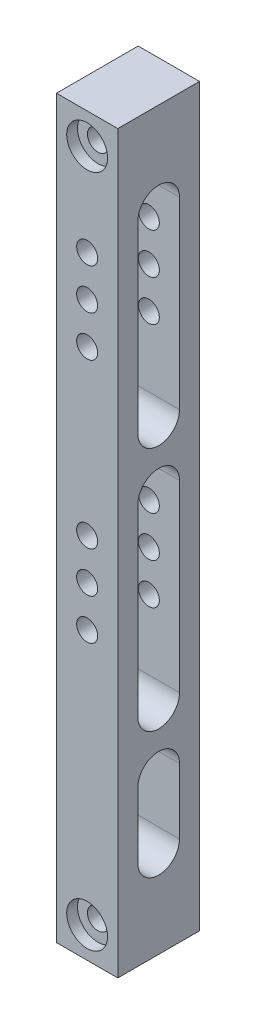
ISO-10303-21;
HEADER;
FILE_DESCRIPTION(('STEP AP214'),'2;1');
FILE_NAME('part.step','',(''),(''),'','','');
FILE_SCHEMA(('AUTOMOTIVE_DESIGN { 1 0 10303 214 1 1 1 1 }'));
ENDSEC;
DATA;
#1=APPLICATION_CONTEXT('core data for automotive mechanical design processes');
#2=APPLICATION_PROTOCOL_DEFINITION('international standard','automotive_design',2000,#1);
#3=PRODUCT_CONTEXT('',#1,'mechanical');
#4=PRODUCT('Part','Part','',(#3));
#5=PRODUCT_RELATED_PRODUCT_CATEGORY('part','',(#4));
#6=PRODUCT_DEFINITION_FORMATION('','',#4);
#7=PRODUCT_DEFINITION_CONTEXT('part definition',#1,'design');
#8=PRODUCT_DEFINITION('design','',#6,#7);
#9=PRODUCT_DEFINITION_SHAPE('','',#8);
#10=(LENGTH_UNIT() NAMED_UNIT(*) SI_UNIT(.MILLI.,.METRE.));
#11=(NAMED_UNIT(*) PLANE_ANGLE_UNIT() SI_UNIT($,.RADIAN.));
#12=(NAMED_UNIT(*) SI_UNIT($,.STERADIAN.) SOLID_ANGLE_UNIT());
#13=UNCERTAINTY_MEASURE_WITH_UNIT(LENGTH_MEASURE(1.E-05),#10,'distance_accuracy_value','');
#14=(GEOMETRIC_REPRESENTATION_CONTEXT(3) GLOBAL_UNCERTAINTY_ASSIGNED_CONTEXT((#13)) GLOBAL_UNIT_ASSIGNED_CONTEXT((#10,
#11,#12)) REPRESENTATION_CONTEXT('',''));
#15=CARTESIAN_POINT('',(0.,0.,0.));
#16=DIRECTION('',(0.,0.,1.));
#17=DIRECTION('',(1.,0.,0.));
#18=AXIS2_PLACEMENT_3D('',#15,#16,#17);
#19=CARTESIAN_POINT('',(-9.525,190.5,12.7));
#20=DIRECTION('',(0.,0.,-1.));
#21=DIRECTION('',(-1.,0.,0.));
#22=AXIS2_PLACEMENT_3D('',#19,#20,#21);
#23=CYLINDRICAL_SURFACE('',#22,3.2639);
#24=CARTESIAN_POINT('',(-9.525,190.5,6.477));
#25=DIRECTION('',(0.,0.,1.));
#26=DIRECTION('',(1.,0.,0.));
#27=AXIS2_PLACEMENT_3D('',#24,#25,#26);
#28=CIRCLE('',#27,3.2639);
#29=CARTESIAN_POINT('',(-6.2611,190.5,6.477));
#30=VERTEX_POINT('',#29);
#31=EDGE_CURVE('E291',#30,#30,#28,.T.);
#32=ORIENTED_EDGE('',*,*,#31,.F.);
#33=EDGE_LOOP('',(#32));
#34=FACE_BOUND('',#33,.T.);
#35=CARTESIAN_POINT('',(-9.525,190.5,12.7));
#36=DIRECTION('',(0.,0.,1.));
#37=DIRECTION('',(1.,0.,0.));
#38=AXIS2_PLACEMENT_3D('',#35,#36,#37);
#39=CIRCLE('',#38,3.2639);
#40=CARTESIAN_POINT('',(-6.2611,190.5,12.7));
#41=VERTEX_POINT('',#40);
#42=EDGE_CURVE('E317',#41,#41,#39,.T.);
#43=ORIENTED_EDGE('',*,*,#42,.T.);
#44=EDGE_LOOP('',(#43));
#45=FACE_BOUND('',#44,.T.);
#46=ADVANCED_FACE('F47',(#34,#45),#23,.F.);
#47=CARTESIAN_POINT('',(-9.525,177.8,12.7));
#48=DIRECTION('',(0.,0.,-1.));
#49=DIRECTION('',(-1.,0.,0.));
#50=AXIS2_PLACEMENT_3D('',#47,#48,#49);
#51=CYLINDRICAL_SURFACE('',#50,3.2639);
#52=CARTESIAN_POINT('',(-9.525,177.8,6.477));
#53=DIRECTION('',(0.,0.,1.));
#54=DIRECTION('',(1.,0.,0.));
#55=AXIS2_PLACEMENT_3D('',#52,#53,#54);
#56=CIRCLE('',#55,3.2639);
#57=CARTESIAN_POINT('',(-6.2611,177.8,6.477));
#58=VERTEX_POINT('',#57);
#59=EDGE_CURVE('E288',#58,#58,#56,.T.);
#60=ORIENTED_EDGE('',*,*,#59,.F.);
#61=EDGE_LOOP('',(#60));
#62=FACE_BOUND('',#61,.T.);
#63=CARTESIAN_POINT('',(-9.525,177.8,12.7));
#64=DIRECTION('',(0.,0.,1.));
#65=DIRECTION('',(1.,0.,0.));
#66=AXIS2_PLACEMENT_3D('',#63,#64,#65);
#67=CIRCLE('',#66,3.2639);
#68=CARTESIAN_POINT('',(-6.2611,177.8,12.7));
#69=VERTEX_POINT('',#68);
#70=EDGE_CURVE('E314',#69,#69,#67,.T.);
#71=ORIENTED_EDGE('',*,*,#70,.T.);
#72=EDGE_LOOP('',(#71));
#73=FACE_BOUND('',#72,.T.);
#74=ADVANCED_FACE('F459',(#62,#73),#51,.F.);
#75=CARTESIAN_POINT('',(-9.525,165.1,12.7));
#76=DIRECTION('',(0.,0.,-1.));
#77=DIRECTION('',(-1.,0.,0.));
#78=AXIS2_PLACEMENT_3D('',#75,#76,#77);
#79=CYLINDRICAL_SURFACE('',#78,3.2639);
#80=CARTESIAN_POINT('',(-9.525,165.1,6.477));
#81=DIRECTION('',(0.,0.,1.));
#82=DIRECTION('',(1.,0.,0.));
#83=AXIS2_PLACEMENT_3D('',#80,#81,#82);
#84=CIRCLE('',#83,3.2639);
#85=CARTESIAN_POINT('',(-6.2611,165.1,6.477));
#86=VERTEX_POINT('',#85);
#87=EDGE_CURVE('E287',#86,#86,#84,.T.);
#88=ORIENTED_EDGE('',*,*,#87,.F.);
#89=EDGE_LOOP('',(#88));
#90=FACE_BOUND('',#89,.T.);
#91=CARTESIAN_POINT('',(-9.525,165.1,12.7));
#92=DIRECTION('',(0.,0.,1.));
#93=DIRECTION('',(1.,0.,0.));
#94=AXIS2_PLACEMENT_3D('',#91,#92,#93);
#95=CIRCLE('',#94,3.2639);
#96=CARTESIAN_POINT('',(-6.2611,165.1,12.7));
#97=VERTEX_POINT('',#96);
#98=EDGE_CURVE('E311',#97,#97,#95,.T.);
#99=ORIENTED_EDGE('',*,*,#98,.T.);
#100=EDGE_LOOP('',(#99));
#101=FACE_BOUND('',#100,.T.);
#102=ADVANCED_FACE('F466',(#90,#101),#79,.F.);
#103=CARTESIAN_POINT('',(-9.525,88.9,12.7));
#104=DIRECTION('',(0.,0.,-1.));
#105=DIRECTION('',(-1.,0.,0.));
#106=AXIS2_PLACEMENT_3D('',#103,#104,#105);
#107=CYLINDRICAL_SURFACE('',#106,3.2639);
#108=CARTESIAN_POINT('',(-9.525,88.9,6.47700000000001));
#109=DIRECTION('',(0.,0.,1.));
#110=DIRECTION('',(1.,0.,0.));
#111=AXIS2_PLACEMENT_3D('',#108,#109,#110);
#112=CIRCLE('',#111,3.2639);
#113=CARTESIAN_POINT('',(-6.2611,88.9,6.47700000000001));
#114=VERTEX_POINT('',#113);
#115=EDGE_CURVE('E277',#114,#114,#112,.T.);
#116=ORIENTED_EDGE('',*,*,#115,.F.);
#117=EDGE_LOOP('',(#116));
#118=FACE_BOUND('',#117,.T.);
#119=CARTESIAN_POINT('',(-9.525,88.9,12.7));
#120=DIRECTION('',(0.,0.,1.));
#121=DIRECTION('',(1.,0.,0.));
#122=AXIS2_PLACEMENT_3D('',#119,#120,#121);
#123=CIRCLE('',#122,3.2639);
#124=CARTESIAN_POINT('',(-6.2611,88.9,12.7));
#125=VERTEX_POINT('',#124);
#126=EDGE_CURVE('E308',#125,#125,#123,.T.);
#127=ORIENTED_EDGE('',*,*,#126,.T.);
#128=EDGE_LOOP('',(#127));
#129=FACE_BOUND('',#128,.T.);
#130=ADVANCED_FACE('F511',(#118,#129),#107,.F.);
#131=CARTESIAN_POINT('',(-9.525,101.6,12.7));
#132=DIRECTION('',(0.,0.,-1.));
#133=DIRECTION('',(-1.,0.,0.));
#134=AXIS2_PLACEMENT_3D('',#131,#132,#133);
#135=CYLINDRICAL_SURFACE('',#134,3.2639);
#136=CARTESIAN_POINT('',(-9.525,101.6,6.47700000000001));
#137=DIRECTION('',(0.,0.,1.));
#138=DIRECTION('',(1.,0.,0.));
#139=AXIS2_PLACEMENT_3D('',#136,#137,#138);
#140=CIRCLE('',#139,3.2639);
#141=CARTESIAN_POINT('',(-6.2611,101.6,6.47700000000001));
#142=VERTEX_POINT('',#141);
#143=EDGE_CURVE('E274',#142,#142,#140,.T.);
#144=ORIENTED_EDGE('',*,*,#143,.F.);
#145=EDGE_LOOP('',(#144));
#146=FACE_BOUND('',#145,.T.);
#147=CARTESIAN_POINT('',(-9.525,101.6,12.7));
#148=DIRECTION('',(0.,0.,1.));
#149=DIRECTION('',(1.,0.,0.));
#150=AXIS2_PLACEMENT_3D('',#147,#148,#149);
#151=CIRCLE('',#150,3.2639);
#152=CARTESIAN_POINT('',(-6.2611,101.6,12.7));
#153=VERTEX_POINT('',#152);
#154=EDGE_CURVE('E305',#153,#153,#151,.T.);
#155=ORIENTED_EDGE('',*,*,#154,.T.);
#156=EDGE_LOOP('',(#155));
#157=FACE_BOUND('',#156,.T.);
#158=ADVANCED_FACE('F517',(#146,#157),#135,.F.);
#159=CARTESIAN_POINT('',(-9.525,114.3,12.7));
#160=DIRECTION('',(0.,0.,-1.));
#161=DIRECTION('',(-1.,0.,0.));
#162=AXIS2_PLACEMENT_3D('',#159,#160,#161);
#163=CYLINDRICAL_SURFACE('',#162,3.2639);
#164=CARTESIAN_POINT('',(-9.525,114.3,6.47700000000001));
#165=DIRECTION('',(0.,0.,1.));
#166=DIRECTION('',(1.,0.,0.));
#167=AXIS2_PLACEMENT_3D('',#164,#165,#166);
#168=CIRCLE('',#167,3.2639);
#169=CARTESIAN_POINT('',(-6.2611,114.3,6.47700000000001));
#170=VERTEX_POINT('',#169);
#171=EDGE_CURVE('E273',#170,#170,#168,.T.);
#172=ORIENTED_EDGE('',*,*,#171,.F.);
#173=EDGE_LOOP('',(#172));
#174=FACE_BOUND('',#173,.T.);
#175=CARTESIAN_POINT('',(-9.525,114.3,12.7));
#176=DIRECTION('',(0.,0.,1.));
#177=DIRECTION('',(1.,0.,0.));
#178=AXIS2_PLACEMENT_3D('',#175,#176,#177);
#179=CIRCLE('',#178,3.2639);
#180=CARTESIAN_POINT('',(-6.2611,114.3,12.7));
#181=VERTEX_POINT('',#180);
#182=EDGE_CURVE('E302',#181,#181,#179,.T.);
#183=ORIENTED_EDGE('',*,*,#182,.T.);
#184=EDGE_LOOP('',(#183));
#185=FACE_BOUND('',#184,.T.);
#186=ADVANCED_FACE('F457',(#174,#185),#163,.F.);
#187=CARTESIAN_POINT('',(-19.05,0.,12.7));
#188=DIRECTION('',(-1.,0.,0.));
#189=DIRECTION('',(0.,-1.,0.));
#190=AXIS2_PLACEMENT_3D('',#187,#188,#189);
#191=PLANE('',#190);
#192=CARTESIAN_POINT('',(-19.05,143.383,0.));
#193=DIRECTION('',(1.,0.,0.));
#194=DIRECTION('',(0.,0.,-1.));
#195=AXIS2_PLACEMENT_3D('',#192,#193,#194);
#196=CIRCLE('',#195,6.477);
#197=CARTESIAN_POINT('',(-19.05,143.383,6.477));
#198=VERTEX_POINT('',#197);
#199=CARTESIAN_POINT('',(-19.05,143.383,-6.477));
#200=VERTEX_POINT('',#199);
#201=EDGE_CURVE('E164',#198,#200,#196,.T.);
#202=ORIENTED_EDGE('',*,*,#201,.T.);
#203=DIRECTION('',(0.,1.,0.));
#204=VECTOR('',#203,1.);
#205=CARTESIAN_POINT('',(-19.05,143.383,-6.477));
#206=LINE('',#205,#204);
#207=CARTESIAN_POINT('',(-19.05,200.533,-6.477));
#208=VERTEX_POINT('',#207);
#209=EDGE_CURVE('E175',#200,#208,#206,.T.);
#210=ORIENTED_EDGE('',*,*,#209,.T.);
#211=CARTESIAN_POINT('',(-19.05,200.533,0.));
#212=DIRECTION('',(1.,0.,0.));
#213=DIRECTION('',(0.,0.,-1.));
#214=AXIS2_PLACEMENT_3D('',#211,#212,#213);
#215=CIRCLE('',#214,6.477);
#216=CARTESIAN_POINT('',(-19.05,200.533,6.477));
#217=VERTEX_POINT('',#216);
#218=EDGE_CURVE('E62',#208,#217,#215,.T.);
#219=ORIENTED_EDGE('',*,*,#218,.T.);
#220=DIRECTION('',(0.,-1.,0.));
#221=VECTOR('',#220,1.);
#222=CARTESIAN_POINT('',(-19.05,143.383,6.477));
#223=LINE('',#222,#221);
#224=EDGE_CURVE('E172',#217,#198,#223,.T.);
#225=ORIENTED_EDGE('',*,*,#224,.T.);
#226=EDGE_LOOP('',(#202,#210,#219,#225));
#227=FACE_BOUND('',#226,.T.);
#228=CARTESIAN_POINT('',(-19.05,27.813,0.));
#229=DIRECTION('',(1.,0.,0.));
#230=DIRECTION('',(0.,0.,-1.));
#231=AXIS2_PLACEMENT_3D('',#228,#229,#230);
#232=CIRCLE('',#231,6.477);
#233=CARTESIAN_POINT('',(-19.05,27.813,6.47700000000003));
#234=VERTEX_POINT('',#233);
#235=CARTESIAN_POINT('',(-19.05,27.813,-6.47699999999997));
#236=VERTEX_POINT('',#235);
#237=EDGE_CURVE('E220',#234,#236,#232,.T.);
#238=ORIENTED_EDGE('',*,*,#237,.T.);
#239=DIRECTION('',(0.,1.,0.));
#240=VECTOR('',#239,1.);
#241=CARTESIAN_POINT('',(-19.05,27.813,-6.47699999999997));
#242=LINE('',#241,#240);
#243=CARTESIAN_POINT('',(-19.05,48.133,-6.47699999999998));
#244=VERTEX_POINT('',#243);
#245=EDGE_CURVE('E230',#236,#244,#242,.T.);
#246=ORIENTED_EDGE('',*,*,#245,.T.);
#247=CARTESIAN_POINT('',(-19.05,48.133,0.));
#248=DIRECTION('',(1.,0.,0.));
#249=DIRECTION('',(0.,0.,-1.));
#250=AXIS2_PLACEMENT_3D('',#247,#248,#249);
#251=CIRCLE('',#250,6.477);
#252=CARTESIAN_POINT('',(-19.05,48.133,6.47700000000002));
#253=VERTEX_POINT('',#252);
#254=EDGE_CURVE('E70',#244,#253,#251,.T.);
#255=ORIENTED_EDGE('',*,*,#254,.T.);
#256=DIRECTION('',(0.,-1.,0.));
#257=VECTOR('',#256,1.);
#258=CARTESIAN_POINT('',(-19.05,27.813,6.47700000000003));
#259=LINE('',#258,#257);
#260=EDGE_CURVE('E208',#253,#234,#259,.T.);
#261=ORIENTED_EDGE('',*,*,#260,.T.);
#262=EDGE_LOOP('',(#238,#246,#255,#261));
#263=FACE_BOUND('',#262,.T.);
#264=CARTESIAN_POINT('',(-19.05,67.183,0.));
#265=DIRECTION('',(1.,0.,0.));
#266=DIRECTION('',(0.,0.,-1.));
#267=AXIS2_PLACEMENT_3D('',#264,#265,#266);
#268=CIRCLE('',#267,6.47700000000001);
#269=CARTESIAN_POINT('',(-19.05,67.183,6.47700000000001));
#270=VERTEX_POINT('',#269);
#271=CARTESIAN_POINT('',(-19.05,67.183,-6.47700000000001));
#272=VERTEX_POINT('',#271);
#273=EDGE_CURVE('E250',#270,#272,#268,.T.);
#274=ORIENTED_EDGE('',*,*,#273,.T.);
#275=DIRECTION('',(0.,1.,0.));
#276=VECTOR('',#275,1.);
#277=CARTESIAN_POINT('',(-19.05,67.183,-6.47700000000001));
#278=LINE('',#277,#276);
#279=CARTESIAN_POINT('',(-19.05,124.333,-6.47700000000001));
#280=VERTEX_POINT('',#279);
#281=EDGE_CURVE('E262',#272,#280,#278,.T.);
#282=ORIENTED_EDGE('',*,*,#281,.T.);
#283=CARTESIAN_POINT('',(-19.05,124.333,0.));
#284=DIRECTION('',(1.,0.,0.));
#285=DIRECTION('',(0.,0.,-1.));
#286=AXIS2_PLACEMENT_3D('',#283,#284,#285);
#287=CIRCLE('',#286,6.47700000000001);
#288=CARTESIAN_POINT('',(-19.05,124.333,6.47700000000001));
#289=VERTEX_POINT('',#288);
#290=EDGE_CURVE('E259',#280,#289,#287,.T.);
#291=ORIENTED_EDGE('',*,*,#290,.T.);
#292=DIRECTION('',(0.,-1.,0.));
#293=VECTOR('',#292,1.);
#294=CARTESIAN_POINT('',(-19.05,67.183,6.47700000000001));
#295=LINE('',#294,#293);
#296=EDGE_CURVE('E238',#289,#270,#295,.T.);
#297=ORIENTED_EDGE('',*,*,#296,.T.);
#298=EDGE_LOOP('',(#274,#282,#291,#297));
#299=FACE_BOUND('',#298,.T.);
#300=DIRECTION('',(0.,1.,0.));
#301=VECTOR('',#300,1.);
#302=CARTESIAN_POINT('',(-19.05,0.,-12.7));
#303=LINE('',#302,#301);
#304=CARTESIAN_POINT('',(-19.05,0.,-12.7));
#305=VERTEX_POINT('',#304);
#306=CARTESIAN_POINT('',(-19.05,228.6,-12.7));
#307=VERTEX_POINT('',#306);
#308=EDGE_CURVE('E349',#305,#307,#303,.T.);
#309=ORIENTED_EDGE('',*,*,#308,.F.);
#310=DIRECTION('',(0.,0.,-1.));
#311=VECTOR('',#310,1.);
#312=CARTESIAN_POINT('',(-19.05,0.,12.7));
#313=LINE('',#312,#311);
#314=CARTESIAN_POINT('',(-19.05,0.,12.7));
#315=VERTEX_POINT('',#314);
#316=EDGE_CURVE('E366',#315,#305,#313,.T.);
#317=ORIENTED_EDGE('',*,*,#316,.F.);
#318=DIRECTION('',(0.,1.,0.));
#319=VECTOR('',#318,1.);
#320=CARTESIAN_POINT('',(-19.05,0.,12.7));
#321=LINE('',#320,#319);
#322=CARTESIAN_POINT('',(-19.05,228.6,12.7));
#323=VERTEX_POINT('',#322);
#324=EDGE_CURVE('E320',#315,#323,#321,.T.);
#325=ORIENTED_EDGE('',*,*,#324,.T.);
#326=DIRECTION('',(0.,0.,-1.));
#327=VECTOR('',#326,1.);
#328=CARTESIAN_POINT('',(-19.05,228.6,12.7));
#329=LINE('',#328,#327);
#330=EDGE_CURVE('E331',#323,#307,#329,.T.);
#331=ORIENTED_EDGE('',*,*,#330,.T.);
#332=EDGE_LOOP('',(#309,#317,#325,#331));
#333=FACE_BOUND('',#332,.T.);
#334=ADVANCED_FACE('F179',(#227,#263,#299,#333),#191,.T.);
#335=CARTESIAN_POINT('',(0.,0.,12.7));
#336=DIRECTION('',(0.,-1.,0.));
#337=DIRECTION('',(1.,0.,0.));
#338=AXIS2_PLACEMENT_3D('',#335,#336,#337);
#339=PLANE('',#338);
#340=DIRECTION('',(-1.,0.,0.));
#341=VECTOR('',#340,1.);
#342=CARTESIAN_POINT('',(0.,0.,-12.7));
#343=LINE('',#342,#341);
#344=CARTESIAN_POINT('',(0.,0.,-12.7));
#345=VERTEX_POINT('',#344);
#346=EDGE_CURVE('E352',#345,#305,#343,.T.);
#347=ORIENTED_EDGE('',*,*,#346,.F.);
#348=DIRECTION('',(0.,0.,-1.));
#349=VECTOR('',#348,1.);
#350=CARTESIAN_POINT('',(0.,0.,12.7));
#351=LINE('',#350,#349);
#352=CARTESIAN_POINT('',(0.,0.,12.7));
#353=VERTEX_POINT('',#352);
#354=EDGE_CURVE('E364',#353,#345,#351,.T.);
#355=ORIENTED_EDGE('',*,*,#354,.F.);
#356=DIRECTION('',(-1.,0.,0.));
#357=VECTOR('',#356,1.);
#358=CARTESIAN_POINT('',(0.,0.,12.7));
#359=LINE('',#358,#357);
#360=EDGE_CURVE('E323',#353,#315,#359,.T.);
#361=ORIENTED_EDGE('',*,*,#360,.T.);
#362=ORIENTED_EDGE('',*,*,#316,.T.);
#363=EDGE_LOOP('',(#347,#355,#361,#362));
#364=FACE_BOUND('',#363,.T.);
#365=ADVANCED_FACE('F411',(#364),#339,.T.);
#366=CARTESIAN_POINT('',(0.,0.,12.7));
#367=DIRECTION('',(-1.,0.,0.));
#368=DIRECTION('',(0.,0.,1.));
#369=AXIS2_PLACEMENT_3D('',#366,#367,#368);
#370=PLANE('',#369);
#371=DIRECTION('',(0.,1.,0.));
#372=VECTOR('',#371,1.);
#373=CARTESIAN_POINT('',(0.,143.383,-6.477));
#374=LINE('',#373,#372);
#375=CARTESIAN_POINT('',(0.,143.383,-6.477));
#376=VERTEX_POINT('',#375);
#377=CARTESIAN_POINT('',(0.,200.533,-6.477));
#378=VERTEX_POINT('',#377);
#379=EDGE_CURVE('E194',#376,#378,#374,.T.);
#380=ORIENTED_EDGE('',*,*,#379,.F.);
#381=CARTESIAN_POINT('',(0.,143.383,0.));
#382=DIRECTION('',(1.,0.,0.));
#383=DIRECTION('',(0.,0.,-1.));
#384=AXIS2_PLACEMENT_3D('',#381,#382,#383);
#385=CIRCLE('',#384,6.477);
#386=CARTESIAN_POINT('',(0.,143.383,6.477));
#387=VERTEX_POINT('',#386);
#388=EDGE_CURVE('E167',#387,#376,#385,.T.);
#389=ORIENTED_EDGE('',*,*,#388,.F.);
#390=DIRECTION('',(0.,-1.,0.));
#391=VECTOR('',#390,1.);
#392=CARTESIAN_POINT('',(0.,143.383,6.477));
#393=LINE('',#392,#391);
#394=CARTESIAN_POINT('',(0.,200.533,6.477));
#395=VERTEX_POINT('',#394);
#396=EDGE_CURVE('E182',#395,#387,#393,.T.);
#397=ORIENTED_EDGE('',*,*,#396,.F.);
#398=CARTESIAN_POINT('',(0.,200.533,0.));
#399=DIRECTION('',(1.,0.,0.));
#400=DIRECTION('',(0.,0.,-1.));
#401=AXIS2_PLACEMENT_3D('',#398,#399,#400);
#402=CIRCLE('',#401,6.477);
#403=EDGE_CURVE('E185',#378,#395,#402,.T.);
#404=ORIENTED_EDGE('',*,*,#403,.F.);
#405=EDGE_LOOP('',(#380,#389,#397,#404));
#406=FACE_BOUND('',#405,.T.);
#407=DIRECTION('',(0.,1.,0.));
#408=VECTOR('',#407,1.);
#409=CARTESIAN_POINT('',(0.,27.813,-6.47699999999997));
#410=LINE('',#409,#408);
#411=CARTESIAN_POINT('',(0.,27.813,-6.47699999999997));
#412=VERTEX_POINT('',#411);
#413=CARTESIAN_POINT('',(0.,48.133,-6.47699999999998));
#414=VERTEX_POINT('',#413);
#415=EDGE_CURVE('E223',#412,#414,#410,.T.);
#416=ORIENTED_EDGE('',*,*,#415,.F.);
#417=CARTESIAN_POINT('',(0.,27.813,0.));
#418=DIRECTION('',(1.,0.,0.));
#419=DIRECTION('',(0.,0.,-1.));
#420=AXIS2_PLACEMENT_3D('',#417,#418,#419);
#421=CIRCLE('',#420,6.477);
#422=CARTESIAN_POINT('',(0.,27.813,6.47700000000003));
#423=VERTEX_POINT('',#422);
#424=EDGE_CURVE('E195',#423,#412,#421,.T.);
#425=ORIENTED_EDGE('',*,*,#424,.F.);
#426=DIRECTION('',(0.,-1.,0.));
#427=VECTOR('',#426,1.);
#428=CARTESIAN_POINT('',(0.,27.813,6.47700000000003));
#429=LINE('',#428,#427);
#430=CARTESIAN_POINT('',(0.,48.133,6.47700000000002));
#431=VERTEX_POINT('',#430);
#432=EDGE_CURVE('E216',#431,#423,#429,.T.);
#433=ORIENTED_EDGE('',*,*,#432,.F.);
#434=CARTESIAN_POINT('',(0.,48.133,0.));
#435=DIRECTION('',(1.,0.,0.));
#436=DIRECTION('',(0.,0.,-1.));
#437=AXIS2_PLACEMENT_3D('',#434,#435,#436);
#438=CIRCLE('',#437,6.477);
#439=EDGE_CURVE('E219',#414,#431,#438,.T.);
#440=ORIENTED_EDGE('',*,*,#439,.F.);
#441=EDGE_LOOP('',(#416,#425,#433,#440));
#442=FACE_BOUND('',#441,.T.);
#443=DIRECTION('',(0.,1.,0.));
#444=VECTOR('',#443,1.);
#445=CARTESIAN_POINT('',(0.,67.183,-6.47700000000001));
#446=LINE('',#445,#444);
#447=CARTESIAN_POINT('',(0.,67.183,-6.47700000000001));
#448=VERTEX_POINT('',#447);
#449=CARTESIAN_POINT('',(0.,124.333,-6.477));
#450=VERTEX_POINT('',#449);
#451=EDGE_CURVE('E253',#448,#450,#446,.T.);
#452=ORIENTED_EDGE('',*,*,#451,.F.);
#453=CARTESIAN_POINT('',(0.,67.183,0.));
#454=DIRECTION('',(1.,0.,0.));
#455=DIRECTION('',(0.,0.,-1.));
#456=AXIS2_PLACEMENT_3D('',#453,#454,#455);
#457=CIRCLE('',#456,6.47700000000001);
#458=CARTESIAN_POINT('',(0.,67.183,6.47700000000001));
#459=VERTEX_POINT('',#458);
#460=EDGE_CURVE('E215',#459,#448,#457,.T.);
#461=ORIENTED_EDGE('',*,*,#460,.F.);
#462=DIRECTION('',(0.,-1.,0.));
#463=VECTOR('',#462,1.);
#464=CARTESIAN_POINT('',(0.,67.183,6.47700000000001));
#465=LINE('',#464,#463);
#466=CARTESIAN_POINT('',(0.,124.333,6.47700000000001));
#467=VERTEX_POINT('',#466);
#468=EDGE_CURVE('E246',#467,#459,#465,.T.);
#469=ORIENTED_EDGE('',*,*,#468,.F.);
#470=CARTESIAN_POINT('',(0.,124.333,0.));
#471=DIRECTION('',(1.,0.,0.));
#472=DIRECTION('',(0.,0.,-1.));
#473=AXIS2_PLACEMENT_3D('',#470,#471,#472);
#474=CIRCLE('',#473,6.47700000000001);
#475=EDGE_CURVE('E249',#450,#467,#474,.T.);
#476=ORIENTED_EDGE('',*,*,#475,.F.);
#477=EDGE_LOOP('',(#452,#461,#469,#476));
#478=FACE_BOUND('',#477,.T.);
#479=DIRECTION('',(0.,1.,0.));
#480=VECTOR('',#479,1.);
#481=CARTESIAN_POINT('',(0.,0.,-12.7));
#482=LINE('',#481,#480);
#483=CARTESIAN_POINT('',(0.,228.6,-12.7));
#484=VERTEX_POINT('',#483);
#485=EDGE_CURVE('E355',#345,#484,#482,.T.);
#486=ORIENTED_EDGE('',*,*,#485,.T.);
#487=DIRECTION('',(0.,0.,-1.));
#488=VECTOR('',#487,1.);
#489=CARTESIAN_POINT('',(0.,228.6,12.7));
#490=LINE('',#489,#488);
#491=CARTESIAN_POINT('',(0.,228.6,12.7));
#492=VERTEX_POINT('',#491);
#493=EDGE_CURVE('E361',#492,#484,#490,.T.);
#494=ORIENTED_EDGE('',*,*,#493,.F.);
#495=DIRECTION('',(0.,1.,0.));
#496=VECTOR('',#495,1.);
#497=CARTESIAN_POINT('',(0.,0.,12.7));
#498=LINE('',#497,#496);
#499=EDGE_CURVE('E326',#353,#492,#498,.T.);
#500=ORIENTED_EDGE('',*,*,#499,.F.);
#501=ORIENTED_EDGE('',*,*,#354,.T.);
#502=EDGE_LOOP('',(#486,#494,#500,#501));
#503=FACE_BOUND('',#502,.T.);
#504=ADVANCED_FACE('F417',(#406,#442,#478,#503),#370,.F.);
#505=CARTESIAN_POINT('',(-9.525,190.5,-6.477));
#506=DIRECTION('',(0.,0.,-1.));
#507=DIRECTION('',(-1.,0.,0.));
#508=AXIS2_PLACEMENT_3D('',#505,#506,#507);
#509=CIRCLE('',#508,3.2639);
#510=CARTESIAN_POINT('',(-12.7889,190.5,-6.477));
#511=VERTEX_POINT('',#510);
#512=EDGE_CURVE('E284',#511,#511,#509,.T.);
#513=ORIENTED_EDGE('',*,*,#512,.F.);
#514=EDGE_LOOP('',(#513));
#515=FACE_BOUND('',#514,.T.);
#516=CARTESIAN_POINT('',(-9.525,190.5,-12.7));
#517=DIRECTION('',(0.,0.,1.));
#518=DIRECTION('',(1.,0.,0.));
#519=AXIS2_PLACEMENT_3D('',#516,#517,#518);
#520=CIRCLE('',#519,3.2639);
#521=CARTESIAN_POINT('',(-6.2611,190.5,-12.7));
#522=VERTEX_POINT('',#521);
#523=EDGE_CURVE('E346',#522,#522,#520,.T.);
#524=ORIENTED_EDGE('',*,*,#523,.F.);
#525=EDGE_LOOP('',(#524));
#526=FACE_BOUND('',#525,.T.);
#527=ADVANCED_FACE('F462',(#515,#526),#23,.F.);
#528=CARTESIAN_POINT('',(-9.525,177.8,-6.477));
#529=DIRECTION('',(0.,0.,-1.));
#530=DIRECTION('',(-1.,0.,0.));
#531=AXIS2_PLACEMENT_3D('',#528,#529,#530);
#532=CIRCLE('',#531,3.2639);
#533=CARTESIAN_POINT('',(-12.7889,177.8,-6.477));
#534=VERTEX_POINT('',#533);
#535=EDGE_CURVE('E281',#534,#534,#532,.T.);
#536=ORIENTED_EDGE('',*,*,#535,.F.);
#537=EDGE_LOOP('',(#536));
#538=FACE_BOUND('',#537,.T.);
#539=CARTESIAN_POINT('',(-9.525,177.8,-12.7));
#540=DIRECTION('',(0.,0.,1.));
#541=DIRECTION('',(1.,0.,0.));
#542=AXIS2_PLACEMENT_3D('',#539,#540,#541);
#543=CIRCLE('',#542,3.2639);
#544=CARTESIAN_POINT('',(-6.2611,177.8,-12.7));
#545=VERTEX_POINT('',#544);
#546=EDGE_CURVE('E343',#545,#545,#543,.T.);
#547=ORIENTED_EDGE('',*,*,#546,.F.);
#548=EDGE_LOOP('',(#547));
#549=FACE_BOUND('',#548,.T.);
#550=ADVANCED_FACE('F469',(#538,#549),#51,.F.);
#551=CARTESIAN_POINT('',(-9.525,165.1,-6.477));
#552=DIRECTION('',(0.,0.,-1.));
#553=DIRECTION('',(-1.,0.,0.));
#554=AXIS2_PLACEMENT_3D('',#551,#552,#553);
#555=CIRCLE('',#554,3.2639);
#556=CARTESIAN_POINT('',(-12.7889,165.1,-6.477));
#557=VERTEX_POINT('',#556);
#558=EDGE_CURVE('E280',#557,#557,#555,.T.);
#559=ORIENTED_EDGE('',*,*,#558,.F.);
#560=EDGE_LOOP('',(#559));
#561=FACE_BOUND('',#560,.T.);
#562=CARTESIAN_POINT('',(-9.525,165.1,-12.7));
#563=DIRECTION('',(0.,0.,1.));
#564=DIRECTION('',(1.,0.,0.));
#565=AXIS2_PLACEMENT_3D('',#562,#563,#564);
#566=CIRCLE('',#565,3.2639);
#567=CARTESIAN_POINT('',(-6.2611,165.1,-12.7));
#568=VERTEX_POINT('',#567);
#569=EDGE_CURVE('E340',#568,#568,#566,.T.);
#570=ORIENTED_EDGE('',*,*,#569,.F.);
#571=EDGE_LOOP('',(#570));
#572=FACE_BOUND('',#571,.T.);
#573=ADVANCED_FACE('F479',(#561,#572),#79,.F.);
#574=CARTESIAN_POINT('',(-9.525,88.9,-6.47700000000001));
#575=DIRECTION('',(0.,0.,-1.));
#576=DIRECTION('',(-1.,0.,0.));
#577=AXIS2_PLACEMENT_3D('',#574,#575,#576);
#578=CIRCLE('',#577,3.2639);
#579=CARTESIAN_POINT('',(-12.7889,88.9,-6.47700000000001));
#580=VERTEX_POINT('',#579);
#581=EDGE_CURVE('E270',#580,#580,#578,.T.);
#582=ORIENTED_EDGE('',*,*,#581,.F.);
#583=EDGE_LOOP('',(#582));
#584=FACE_BOUND('',#583,.T.);
#585=CARTESIAN_POINT('',(-9.525,88.9,-12.7));
#586=DIRECTION('',(0.,0.,1.));
#587=DIRECTION('',(1.,0.,0.));
#588=AXIS2_PLACEMENT_3D('',#585,#586,#587);
#589=CIRCLE('',#588,3.2639);
#590=CARTESIAN_POINT('',(-6.2611,88.9,-12.7));
#591=VERTEX_POINT('',#590);
#592=EDGE_CURVE('E337',#591,#591,#589,.T.);
#593=ORIENTED_EDGE('',*,*,#592,.F.);
#594=EDGE_LOOP('',(#593));
#595=FACE_BOUND('',#594,.T.);
#596=ADVANCED_FACE('F499',(#584,#595),#107,.F.);
#597=CARTESIAN_POINT('',(-9.525,101.6,-6.47700000000001));
#598=DIRECTION('',(0.,0.,-1.));
#599=DIRECTION('',(-1.,0.,0.));
#600=AXIS2_PLACEMENT_3D('',#597,#598,#599);
#601=CIRCLE('',#600,3.2639);
#602=CARTESIAN_POINT('',(-12.7889,101.6,-6.47700000000001));
#603=VERTEX_POINT('',#602);
#604=EDGE_CURVE('E267',#603,#603,#601,.T.);
#605=ORIENTED_EDGE('',*,*,#604,.F.);
#606=EDGE_LOOP('',(#605));
#607=FACE_BOUND('',#606,.T.);
#608=CARTESIAN_POINT('',(-9.525,101.6,-12.7));
#609=DIRECTION('',(0.,0.,1.));
#610=DIRECTION('',(1.,0.,0.));
#611=AXIS2_PLACEMENT_3D('',#608,#609,#610);
#612=CIRCLE('',#611,3.2639);
#613=CARTESIAN_POINT('',(-6.2611,101.6,-12.7));
#614=VERTEX_POINT('',#613);
#615=EDGE_CURVE('E334',#614,#614,#612,.T.);
#616=ORIENTED_EDGE('',*,*,#615,.F.);
#617=EDGE_LOOP('',(#616));
#618=FACE_BOUND('',#617,.T.);
#619=ADVANCED_FACE('F454',(#607,#618),#135,.F.);
#620=CARTESIAN_POINT('',(-9.525,114.3,-6.47700000000001));
#621=DIRECTION('',(0.,0.,-1.));
#622=DIRECTION('',(-1.,0.,0.));
#623=AXIS2_PLACEMENT_3D('',#620,#621,#622);
#624=CIRCLE('',#623,3.2639);
#625=CARTESIAN_POINT('',(-12.7889,114.3,-6.47700000000001));
#626=VERTEX_POINT('',#625);
#627=EDGE_CURVE('E201',#626,#626,#624,.T.);
#628=ORIENTED_EDGE('',*,*,#627,.F.);
#629=EDGE_LOOP('',(#628));
#630=FACE_BOUND('',#629,.T.);
#631=CARTESIAN_POINT('',(-9.525,114.3,-12.7));
#632=DIRECTION('',(0.,0.,1.));
#633=DIRECTION('',(1.,0.,0.));
#634=AXIS2_PLACEMENT_3D('',#631,#632,#633);
#635=CIRCLE('',#634,3.2639);
#636=CARTESIAN_POINT('',(-6.2611,114.3,-12.7));
#637=VERTEX_POINT('',#636);
#638=EDGE_CURVE('E294',#637,#637,#635,.T.);
#639=ORIENTED_EDGE('',*,*,#638,.F.);
#640=EDGE_LOOP('',(#639));
#641=FACE_BOUND('',#640,.T.);
#642=ADVANCED_FACE('F449',(#630,#641),#163,.F.);
#643=CARTESIAN_POINT('',(-9.525,219.075,12.7));
#644=DIRECTION('',(0.,0.,-1.));
#645=DIRECTION('',(-1.,0.,0.));
#646=AXIS2_PLACEMENT_3D('',#643,#644,#645);
#647=CYLINDRICAL_SURFACE('',#646,6.35);
#648=CARTESIAN_POINT('',(-9.525,219.075,9.3472));
#649=DIRECTION('',(0.,0.,1.));
#650=DIRECTION('',(1.,0.,0.));
#651=AXIS2_PLACEMENT_3D('',#648,#649,#650);
#652=CIRCLE('',#651,6.35);
#653=CARTESIAN_POINT('',(-3.175,219.075,9.3472));
#654=VERTEX_POINT('',#653);
#655=EDGE_CURVE('E11',#654,#654,#652,.T.);
#656=ORIENTED_EDGE('',*,*,#655,.F.);
#657=EDGE_LOOP('',(#656));
#658=FACE_BOUND('',#657,.T.);
#659=CARTESIAN_POINT('',(-9.525,219.075,12.7));
#660=DIRECTION('',(0.,0.,1.));
#661=DIRECTION('',(1.,0.,0.));
#662=AXIS2_PLACEMENT_3D('',#659,#660,#661);
#663=CIRCLE('',#662,6.35);
#664=CARTESIAN_POINT('',(-3.175,219.075,12.7));
#665=VERTEX_POINT('',#664);
#666=EDGE_CURVE('E298',#665,#665,#663,.T.);
#667=ORIENTED_EDGE('',*,*,#666,.T.);
#668=EDGE_LOOP('',(#667));
#669=FACE_BOUND('',#668,.T.);
#670=ADVANCED_FACE('F383',(#658,#669),#647,.F.);
#671=CARTESIAN_POINT('',(-9.525,9.525,12.7));
#672=DIRECTION('',(0.,0.,-1.));
#673=DIRECTION('',(-1.,0.,0.));
#674=AXIS2_PLACEMENT_3D('',#671,#672,#673);
#675=CYLINDRICAL_SURFACE('',#674,6.35);
#676=CARTESIAN_POINT('',(-9.525,9.525,9.3472));
#677=DIRECTION('',(0.,0.,1.));
#678=DIRECTION('',(1.,0.,0.));
#679=AXIS2_PLACEMENT_3D('',#676,#677,#678);
#680=CIRCLE('',#679,6.35);
#681=CARTESIAN_POINT('',(-3.175,9.525,9.3472));
#682=VERTEX_POINT('',#681);
#683=EDGE_CURVE('E55',#682,#682,#680,.T.);
#684=ORIENTED_EDGE('',*,*,#683,.F.);
#685=EDGE_LOOP('',(#684));
#686=FACE_BOUND('',#685,.T.);
#687=CARTESIAN_POINT('',(-9.525,9.525,12.7));
#688=DIRECTION('',(0.,0.,1.));
#689=DIRECTION('',(1.,0.,0.));
#690=AXIS2_PLACEMENT_3D('',#687,#688,#689);
#691=CIRCLE('',#690,6.35);
#692=CARTESIAN_POINT('',(-3.175,9.525,12.7));
#693=VERTEX_POINT('',#692);
#694=EDGE_CURVE('E295',#693,#693,#691,.T.);
#695=ORIENTED_EDGE('',*,*,#694,.T.);
#696=EDGE_LOOP('',(#695));
#697=FACE_BOUND('',#696,.T.);
#698=ADVANCED_FACE('F49',(#686,#697),#675,.F.);
#699=CARTESIAN_POINT('',(0.,228.6,12.7));
#700=DIRECTION('',(0.,-1.,0.));
#701=DIRECTION('',(0.,0.,-1.));
#702=AXIS2_PLACEMENT_3D('',#699,#700,#701);
#703=PLANE('',#702);
#704=DIRECTION('',(-1.,0.,0.));
#705=VECTOR('',#704,1.);
#706=CARTESIAN_POINT('',(0.,228.6,-12.7));
#707=LINE('',#706,#705);
#708=EDGE_CURVE('E299',#484,#307,#707,.T.);
#709=ORIENTED_EDGE('',*,*,#708,.T.);
#710=ORIENTED_EDGE('',*,*,#330,.F.);
#711=DIRECTION('',(-1.,0.,0.));
#712=VECTOR('',#711,1.);
#713=CARTESIAN_POINT('',(0.,228.6,12.7));
#714=LINE('',#713,#712);
#715=EDGE_CURVE('E329',#492,#323,#714,.T.);
#716=ORIENTED_EDGE('',*,*,#715,.F.);
#717=ORIENTED_EDGE('',*,*,#493,.T.);
#718=EDGE_LOOP('',(#709,#710,#716,#717));
#719=FACE_BOUND('',#718,.T.);
#720=ADVANCED_FACE('F382',(#719),#703,.F.);
#721=CARTESIAN_POINT('',(0.,0.,12.7));
#722=DIRECTION('',(0.,0.,1.));
#723=DIRECTION('',(1.,0.,0.));
#724=AXIS2_PLACEMENT_3D('',#721,#722,#723);
#725=PLANE('',#724);
#726=ORIENTED_EDGE('',*,*,#694,.F.);
#727=EDGE_LOOP('',(#726));
#728=FACE_BOUND('',#727,.T.);
#729=ORIENTED_EDGE('',*,*,#666,.F.);
#730=EDGE_LOOP('',(#729));
#731=FACE_BOUND('',#730,.T.);
#732=ORIENTED_EDGE('',*,*,#182,.F.);
#733=EDGE_LOOP('',(#732));
#734=FACE_BOUND('',#733,.T.);
#735=ORIENTED_EDGE('',*,*,#154,.F.);
#736=EDGE_LOOP('',(#735));
#737=FACE_BOUND('',#736,.T.);
#738=ORIENTED_EDGE('',*,*,#126,.F.);
#739=EDGE_LOOP('',(#738));
#740=FACE_BOUND('',#739,.T.);
#741=ORIENTED_EDGE('',*,*,#98,.F.);
#742=EDGE_LOOP('',(#741));
#743=FACE_BOUND('',#742,.T.);
#744=ORIENTED_EDGE('',*,*,#70,.F.);
#745=EDGE_LOOP('',(#744));
#746=FACE_BOUND('',#745,.T.);
#747=ORIENTED_EDGE('',*,*,#42,.F.);
#748=EDGE_LOOP('',(#747));
#749=FACE_BOUND('',#748,.T.);
#750=ORIENTED_EDGE('',*,*,#324,.F.);
#751=ORIENTED_EDGE('',*,*,#360,.F.);
#752=ORIENTED_EDGE('',*,*,#499,.T.);
#753=ORIENTED_EDGE('',*,*,#715,.T.);
#754=EDGE_LOOP('',(#750,#751,#752,#753));
#755=FACE_BOUND('',#754,.T.);
#756=ADVANCED_FACE('F386',(#728,#731,#734,#737,#740,#743,#746,#749,#755),#725,.T.);
#757=CARTESIAN_POINT('',(0.,0.,-12.7));
#758=DIRECTION('',(0.,0.,1.));
#759=DIRECTION('',(1.,0.,0.));
#760=AXIS2_PLACEMENT_3D('',#757,#758,#759);
#761=PLANE('',#760);
#762=ORIENTED_EDGE('',*,*,#638,.T.);
#763=EDGE_LOOP('',(#762));
#764=FACE_BOUND('',#763,.T.);
#765=ORIENTED_EDGE('',*,*,#615,.T.);
#766=EDGE_LOOP('',(#765));
#767=FACE_BOUND('',#766,.T.);
#768=ORIENTED_EDGE('',*,*,#592,.T.);
#769=EDGE_LOOP('',(#768));
#770=FACE_BOUND('',#769,.T.);
#771=ORIENTED_EDGE('',*,*,#569,.T.);
#772=EDGE_LOOP('',(#771));
#773=FACE_BOUND('',#772,.T.);
#774=ORIENTED_EDGE('',*,*,#546,.T.);
#775=EDGE_LOOP('',(#774));
#776=FACE_BOUND('',#775,.T.);
#777=ORIENTED_EDGE('',*,*,#523,.T.);
#778=EDGE_LOOP('',(#777));
#779=FACE_BOUND('',#778,.T.);
#780=ORIENTED_EDGE('',*,*,#308,.T.);
#781=ORIENTED_EDGE('',*,*,#708,.F.);
#782=ORIENTED_EDGE('',*,*,#485,.F.);
#783=ORIENTED_EDGE('',*,*,#346,.T.);
#784=EDGE_LOOP('',(#780,#781,#782,#783));
#785=FACE_BOUND('',#784,.T.);
#786=CARTESIAN_POINT('',(-9.525,9.525,-12.7));
#787=DIRECTION('',(0.,0.,1.));
#788=DIRECTION('',(1.,0.,0.));
#789=AXIS2_PLACEMENT_3D('',#786,#787,#788);
#790=CIRCLE('',#789,3.2639);
#791=CARTESIAN_POINT('',(-6.2611,9.525,-12.7));
#792=VERTEX_POINT('',#791);
#793=EDGE_CURVE('E428',#792,#792,#790,.F.);
#794=ORIENTED_EDGE('',*,*,#793,.F.);
#795=EDGE_LOOP('',(#794));
#796=FACE_BOUND('',#795,.T.);
#797=CARTESIAN_POINT('',(-9.525,219.075,-12.7));
#798=DIRECTION('',(0.,0.,1.));
#799=DIRECTION('',(1.,0.,0.));
#800=AXIS2_PLACEMENT_3D('',#797,#798,#799);
#801=CIRCLE('',#800,3.2639);
#802=CARTESIAN_POINT('',(-6.2611,219.075,-12.7));
#803=VERTEX_POINT('',#802);
#804=EDGE_CURVE('E431',#803,#803,#801,.F.);
#805=ORIENTED_EDGE('',*,*,#804,.F.);
#806=EDGE_LOOP('',(#805));
#807=FACE_BOUND('',#806,.T.);
#808=ADVANCED_FACE('F389',(#764,#767,#770,#773,#776,#779,#785,#796,#807),#761,.F.);
#809=CARTESIAN_POINT('',(-19.05,67.183,0.));
#810=DIRECTION('',(1.,0.,0.));
#811=DIRECTION('',(0.,0.,-1.));
#812=AXIS2_PLACEMENT_3D('',#809,#810,#811);
#813=CYLINDRICAL_SURFACE('',#812,6.47700000000001);
#814=ORIENTED_EDGE('',*,*,#460,.T.);
#815=DIRECTION('',(1.,0.,0.));
#816=VECTOR('',#815,1.);
#817=CARTESIAN_POINT('',(-19.05,67.183,-6.47700000000001));
#818=LINE('',#817,#816);
#819=EDGE_CURVE('E235',#272,#448,#818,.T.);
#820=ORIENTED_EDGE('',*,*,#819,.F.);
#821=ORIENTED_EDGE('',*,*,#273,.F.);
#822=DIRECTION('',(1.,0.,0.));
#823=VECTOR('',#822,1.);
#824=CARTESIAN_POINT('',(-19.05,67.183,6.47700000000001));
#825=LINE('',#824,#823);
#826=EDGE_CURVE('E243',#270,#459,#825,.T.);
#827=ORIENTED_EDGE('',*,*,#826,.T.);
#828=EDGE_LOOP('',(#814,#820,#821,#827));
#829=FACE_BOUND('',#828,.T.);
#830=ADVANCED_FACE('F422',(#829),#813,.F.);
#831=CARTESIAN_POINT('',(-19.05,67.183,6.47700000000001));
#832=DIRECTION('',(0.,0.,1.));
#833=DIRECTION('',(1.,0.,0.));
#834=AXIS2_PLACEMENT_3D('',#831,#832,#833);
#835=PLANE('',#834);
#836=ORIENTED_EDGE('',*,*,#115,.T.);
#837=EDGE_LOOP('',(#836));
#838=FACE_BOUND('',#837,.T.);
#839=ORIENTED_EDGE('',*,*,#143,.T.);
#840=EDGE_LOOP('',(#839));
#841=FACE_BOUND('',#840,.T.);
#842=ORIENTED_EDGE('',*,*,#171,.T.);
#843=EDGE_LOOP('',(#842));
#844=FACE_BOUND('',#843,.T.);
#845=ORIENTED_EDGE('',*,*,#468,.T.);
#846=ORIENTED_EDGE('',*,*,#826,.F.);
#847=ORIENTED_EDGE('',*,*,#296,.F.);
#848=DIRECTION('',(1.,0.,0.));
#849=VECTOR('',#848,1.);
#850=CARTESIAN_POINT('',(-19.05,124.333,6.47700000000001));
#851=LINE('',#850,#849);
#852=EDGE_CURVE('E241',#289,#467,#851,.T.);
#853=ORIENTED_EDGE('',*,*,#852,.T.);
#854=EDGE_LOOP('',(#845,#846,#847,#853));
#855=FACE_BOUND('',#854,.T.);
#856=ADVANCED_FACE('F555',(#838,#841,#844,#855),#835,.F.);
#857=CARTESIAN_POINT('',(-19.05,124.333,0.));
#858=DIRECTION('',(1.,0.,0.));
#859=DIRECTION('',(0.,0.,-1.));
#860=AXIS2_PLACEMENT_3D('',#857,#858,#859);
#861=CYLINDRICAL_SURFACE('',#860,6.47700000000001);
#862=ORIENTED_EDGE('',*,*,#475,.T.);
#863=ORIENTED_EDGE('',*,*,#852,.F.);
#864=ORIENTED_EDGE('',*,*,#290,.F.);
#865=DIRECTION('',(1.,0.,0.));
#866=VECTOR('',#865,1.);
#867=CARTESIAN_POINT('',(-19.05,124.333,-6.477));
#868=LINE('',#867,#866);
#869=EDGE_CURVE('E239',#280,#450,#868,.T.);
#870=ORIENTED_EDGE('',*,*,#869,.T.);
#871=EDGE_LOOP('',(#862,#863,#864,#870));
#872=FACE_BOUND('',#871,.T.);
#873=ADVANCED_FACE('F559',(#872),#861,.F.);
#874=CARTESIAN_POINT('',(-19.05,67.183,-6.47700000000001));
#875=DIRECTION('',(0.,0.,-1.));
#876=DIRECTION('',(-1.,0.,0.));
#877=AXIS2_PLACEMENT_3D('',#874,#875,#876);
#878=PLANE('',#877);
#879=ORIENTED_EDGE('',*,*,#581,.T.);
#880=EDGE_LOOP('',(#879));
#881=FACE_BOUND('',#880,.T.);
#882=ORIENTED_EDGE('',*,*,#604,.T.);
#883=EDGE_LOOP('',(#882));
#884=FACE_BOUND('',#883,.T.);
#885=ORIENTED_EDGE('',*,*,#627,.T.);
#886=EDGE_LOOP('',(#885));
#887=FACE_BOUND('',#886,.T.);
#888=ORIENTED_EDGE('',*,*,#451,.T.);
#889=ORIENTED_EDGE('',*,*,#869,.F.);
#890=ORIENTED_EDGE('',*,*,#281,.F.);
#891=ORIENTED_EDGE('',*,*,#819,.T.);
#892=EDGE_LOOP('',(#888,#889,#890,#891));
#893=FACE_BOUND('',#892,.T.);
#894=ADVANCED_FACE('F538',(#881,#884,#887,#893),#878,.F.);
#895=CARTESIAN_POINT('',(-19.05,143.383,0.));
#896=DIRECTION('',(1.,0.,0.));
#897=DIRECTION('',(0.,0.,-1.));
#898=AXIS2_PLACEMENT_3D('',#895,#896,#897);
#899=CYLINDRICAL_SURFACE('',#898,6.477);
#900=ORIENTED_EDGE('',*,*,#388,.T.);
#901=DIRECTION('',(1.,0.,0.));
#902=VECTOR('',#901,1.);
#903=CARTESIAN_POINT('',(-19.05,143.383,-6.477));
#904=LINE('',#903,#902);
#905=EDGE_CURVE('E160',#200,#376,#904,.T.);
#906=ORIENTED_EDGE('',*,*,#905,.F.);
#907=ORIENTED_EDGE('',*,*,#201,.F.);
#908=DIRECTION('',(1.,0.,0.));
#909=VECTOR('',#908,1.);
#910=CARTESIAN_POINT('',(-19.05,143.383,6.477));
#911=LINE('',#910,#909);
#912=EDGE_CURVE('E199',#198,#387,#911,.T.);
#913=ORIENTED_EDGE('',*,*,#912,.T.);
#914=EDGE_LOOP('',(#900,#906,#907,#913));
#915=FACE_BOUND('',#914,.T.);
#916=ADVANCED_FACE('F162',(#915),#899,.F.);
#917=CARTESIAN_POINT('',(-19.05,143.383,6.477));
#918=DIRECTION('',(0.,0.,1.));
#919=DIRECTION('',(1.,0.,0.));
#920=AXIS2_PLACEMENT_3D('',#917,#918,#919);
#921=PLANE('',#920);
#922=ORIENTED_EDGE('',*,*,#31,.T.);
#923=EDGE_LOOP('',(#922));
#924=FACE_BOUND('',#923,.T.);
#925=ORIENTED_EDGE('',*,*,#59,.T.);
#926=EDGE_LOOP('',(#925));
#927=FACE_BOUND('',#926,.T.);
#928=ORIENTED_EDGE('',*,*,#87,.T.);
#929=EDGE_LOOP('',(#928));
#930=FACE_BOUND('',#929,.T.);
#931=ORIENTED_EDGE('',*,*,#396,.T.);
#932=ORIENTED_EDGE('',*,*,#912,.F.);
#933=ORIENTED_EDGE('',*,*,#224,.F.);
#934=DIRECTION('',(1.,0.,0.));
#935=VECTOR('',#934,1.);
#936=CARTESIAN_POINT('',(-19.05,200.533,6.477));
#937=LINE('',#936,#935);
#938=EDGE_CURVE('E202',#217,#395,#937,.T.);
#939=ORIENTED_EDGE('',*,*,#938,.T.);
#940=EDGE_LOOP('',(#931,#932,#933,#939));
#941=FACE_BOUND('',#940,.T.);
#942=ADVANCED_FACE('F522',(#924,#927,#930,#941),#921,.F.);
#943=CARTESIAN_POINT('',(-19.05,200.533,0.));
#944=DIRECTION('',(1.,0.,0.));
#945=DIRECTION('',(0.,0.,-1.));
#946=AXIS2_PLACEMENT_3D('',#943,#944,#945);
#947=CYLINDRICAL_SURFACE('',#946,6.477);
#948=ORIENTED_EDGE('',*,*,#403,.T.);
#949=ORIENTED_EDGE('',*,*,#938,.F.);
#950=ORIENTED_EDGE('',*,*,#218,.F.);
#951=DIRECTION('',(1.,0.,0.));
#952=VECTOR('',#951,1.);
#953=CARTESIAN_POINT('',(-19.05,200.533,-6.477));
#954=LINE('',#953,#952);
#955=EDGE_CURVE('E171',#208,#378,#954,.T.);
#956=ORIENTED_EDGE('',*,*,#955,.T.);
#957=EDGE_LOOP('',(#948,#949,#950,#956));
#958=FACE_BOUND('',#957,.T.);
#959=ADVANCED_FACE('F491',(#958),#947,.F.);
#960=CARTESIAN_POINT('',(-19.05,143.383,-6.477));
#961=DIRECTION('',(0.,0.,-1.));
#962=DIRECTION('',(-1.,0.,0.));
#963=AXIS2_PLACEMENT_3D('',#960,#961,#962);
#964=PLANE('',#963);
#965=ORIENTED_EDGE('',*,*,#512,.T.);
#966=EDGE_LOOP('',(#965));
#967=FACE_BOUND('',#966,.T.);
#968=ORIENTED_EDGE('',*,*,#535,.T.);
#969=EDGE_LOOP('',(#968));
#970=FACE_BOUND('',#969,.T.);
#971=ORIENTED_EDGE('',*,*,#558,.T.);
#972=EDGE_LOOP('',(#971));
#973=FACE_BOUND('',#972,.T.);
#974=ORIENTED_EDGE('',*,*,#379,.T.);
#975=ORIENTED_EDGE('',*,*,#955,.F.);
#976=ORIENTED_EDGE('',*,*,#209,.F.);
#977=ORIENTED_EDGE('',*,*,#905,.T.);
#978=EDGE_LOOP('',(#974,#975,#976,#977));
#979=FACE_BOUND('',#978,.T.);
#980=ADVANCED_FACE('F176',(#967,#970,#973,#979),#964,.F.);
#981=CARTESIAN_POINT('',(-19.05,27.813,0.));
#982=DIRECTION('',(1.,0.,0.));
#983=DIRECTION('',(0.,0.,-1.));
#984=AXIS2_PLACEMENT_3D('',#981,#982,#983);
#985=CYLINDRICAL_SURFACE('',#984,6.477);
#986=ORIENTED_EDGE('',*,*,#424,.T.);
#987=DIRECTION('',(1.,0.,0.));
#988=VECTOR('',#987,1.);
#989=CARTESIAN_POINT('',(-19.05,27.813,-6.47699999999997));
#990=LINE('',#989,#988);
#991=EDGE_CURVE('E205',#236,#412,#990,.T.);
#992=ORIENTED_EDGE('',*,*,#991,.F.);
#993=ORIENTED_EDGE('',*,*,#237,.F.);
#994=DIRECTION('',(1.,0.,0.));
#995=VECTOR('',#994,1.);
#996=CARTESIAN_POINT('',(-19.05,27.813,6.47700000000003));
#997=LINE('',#996,#995);
#998=EDGE_CURVE('E213',#234,#423,#997,.T.);
#999=ORIENTED_EDGE('',*,*,#998,.T.);
#1000=EDGE_LOOP('',(#986,#992,#993,#999));
#1001=FACE_BOUND('',#1000,.T.);
#1002=ADVANCED_FACE('F490',(#1001),#985,.F.);
#1003=CARTESIAN_POINT('',(-19.05,27.813,6.47700000000003));
#1004=DIRECTION('',(0.,0.,1.));
#1005=DIRECTION('',(0.,-1.,0.));
#1006=AXIS2_PLACEMENT_3D('',#1003,#1004,#1005);
#1007=PLANE('',#1006);
#1008=ORIENTED_EDGE('',*,*,#432,.T.);
#1009=ORIENTED_EDGE('',*,*,#998,.F.);
#1010=ORIENTED_EDGE('',*,*,#260,.F.);
#1011=DIRECTION('',(1.,0.,0.));
#1012=VECTOR('',#1011,1.);
#1013=CARTESIAN_POINT('',(-19.05,48.133,6.47700000000002));
#1014=LINE('',#1013,#1012);
#1015=EDGE_CURVE('E211',#253,#431,#1014,.T.);
#1016=ORIENTED_EDGE('',*,*,#1015,.T.);
#1017=EDGE_LOOP('',(#1008,#1009,#1010,#1016));
#1018=FACE_BOUND('',#1017,.T.);
#1019=ADVANCED_FACE('F541',(#1018),#1007,.F.);
#1020=CARTESIAN_POINT('',(-19.05,48.133,0.));
#1021=DIRECTION('',(1.,0.,0.));
#1022=DIRECTION('',(0.,0.,-1.));
#1023=AXIS2_PLACEMENT_3D('',#1020,#1021,#1022);
#1024=CYLINDRICAL_SURFACE('',#1023,6.477);
#1025=ORIENTED_EDGE('',*,*,#439,.T.);
#1026=ORIENTED_EDGE('',*,*,#1015,.F.);
#1027=ORIENTED_EDGE('',*,*,#254,.F.);
#1028=DIRECTION('',(1.,0.,0.));
#1029=VECTOR('',#1028,1.);
#1030=CARTESIAN_POINT('',(-19.05,48.133,-6.47699999999998));
#1031=LINE('',#1030,#1029);
#1032=EDGE_CURVE('E209',#244,#414,#1031,.T.);
#1033=ORIENTED_EDGE('',*,*,#1032,.T.);
#1034=EDGE_LOOP('',(#1025,#1026,#1027,#1033));
#1035=FACE_BOUND('',#1034,.T.);
#1036=ADVANCED_FACE('F546',(#1035),#1024,.F.);
#1037=CARTESIAN_POINT('',(-19.05,27.813,-6.47699999999997));
#1038=DIRECTION('',(0.,0.,-1.));
#1039=DIRECTION('',(0.,1.,0.));
#1040=AXIS2_PLACEMENT_3D('',#1037,#1038,#1039);
#1041=PLANE('',#1040);
#1042=ORIENTED_EDGE('',*,*,#415,.T.);
#1043=ORIENTED_EDGE('',*,*,#1032,.F.);
#1044=ORIENTED_EDGE('',*,*,#245,.F.);
#1045=ORIENTED_EDGE('',*,*,#991,.T.);
#1046=EDGE_LOOP('',(#1042,#1043,#1044,#1045));
#1047=FACE_BOUND('',#1046,.T.);
#1048=ADVANCED_FACE('F543',(#1047),#1041,.F.);
#1049=CARTESIAN_POINT('',(-9.525,9.525,9.3472));
#1050=DIRECTION('',(0.,0.,-1.));
#1051=DIRECTION('',(-1.,0.,0.));
#1052=AXIS2_PLACEMENT_3D('',#1049,#1050,#1051);
#1053=CYLINDRICAL_SURFACE('',#1052,3.2639);
#1054=CARTESIAN_POINT('',(-9.525,9.525,9.3472));
#1055=DIRECTION('',(0.,0.,1.));
#1056=DIRECTION('',(1.,0.,0.));
#1057=AXIS2_PLACEMENT_3D('',#1054,#1055,#1056);
#1058=CIRCLE('',#1057,3.2639);
#1059=CARTESIAN_POINT('',(-6.2611,9.525,9.3472));
#1060=VERTEX_POINT('',#1059);
#1061=EDGE_CURVE('E188',#1060,#1060,#1058,.T.);
#1062=ORIENTED_EDGE('',*,*,#1061,.T.);
#1063=EDGE_LOOP('',(#1062));
#1064=FACE_BOUND('',#1063,.T.);
#1065=ORIENTED_EDGE('',*,*,#793,.T.);
#1066=EDGE_LOOP('',(#1065));
#1067=FACE_BOUND('',#1066,.T.);
#1068=ADVANCED_FACE('F545',(#1064,#1067),#1053,.F.);
#1069=CARTESIAN_POINT('',(0.,0.,9.3472));
#1070=DIRECTION('',(0.,0.,1.));
#1071=DIRECTION('',(1.,0.,0.));
#1072=AXIS2_PLACEMENT_3D('',#1069,#1070,#1071);
#1073=PLANE('',#1072);
#1074=ORIENTED_EDGE('',*,*,#1061,.F.);
#1075=EDGE_LOOP('',(#1074));
#1076=FACE_BOUND('',#1075,.T.);
#1077=ORIENTED_EDGE('',*,*,#683,.T.);
#1078=EDGE_LOOP('',(#1077));
#1079=FACE_BOUND('',#1078,.T.);
#1080=ADVANCED_FACE('F378',(#1076,#1079),#1073,.T.);
#1081=CARTESIAN_POINT('',(-9.525,219.075,9.3472));
#1082=DIRECTION('',(0.,0.,-1.));
#1083=DIRECTION('',(-1.,0.,0.));
#1084=AXIS2_PLACEMENT_3D('',#1081,#1082,#1083);
#1085=CYLINDRICAL_SURFACE('',#1084,3.2639);
#1086=CARTESIAN_POINT('',(-9.525,219.075,9.3472));
#1087=DIRECTION('',(0.,0.,1.));
#1088=DIRECTION('',(1.,0.,0.));
#1089=AXIS2_PLACEMENT_3D('',#1086,#1087,#1088);
#1090=CIRCLE('',#1089,3.2639);
#1091=CARTESIAN_POINT('',(-6.2611,219.075,9.3472));
#1092=VERTEX_POINT('',#1091);
#1093=EDGE_CURVE('E245',#1092,#1092,#1090,.T.);
#1094=ORIENTED_EDGE('',*,*,#1093,.T.);
#1095=EDGE_LOOP('',(#1094));
#1096=FACE_BOUND('',#1095,.T.);
#1097=ORIENTED_EDGE('',*,*,#804,.T.);
#1098=EDGE_LOOP('',(#1097));
#1099=FACE_BOUND('',#1098,.T.);
#1100=ADVANCED_FACE('F439',(#1096,#1099),#1085,.F.);
#1101=CARTESIAN_POINT('',(0.,0.,9.3472));
#1102=DIRECTION('',(0.,0.,1.));
#1103=DIRECTION('',(1.,0.,0.));
#1104=AXIS2_PLACEMENT_3D('',#1101,#1102,#1103);
#1105=PLANE('',#1104);
#1106=ORIENTED_EDGE('',*,*,#1093,.F.);
#1107=EDGE_LOOP('',(#1106));
#1108=FACE_BOUND('',#1107,.T.);
#1109=ORIENTED_EDGE('',*,*,#655,.T.);
#1110=EDGE_LOOP('',(#1109));
#1111=FACE_BOUND('',#1110,.T.);
#1112=ADVANCED_FACE('F441',(#1108,#1111),#1105,.T.);
#1113=CLOSED_SHELL('',(#46,#74,#102,#130,#158,#186,#334,#365,#504,#527,#550,#573,#596,#619,#642,
#670,#698,#720,#756,#808,#830,#856,#873,#894,#916,#942,#959,#980,#1002,#1019,#1036,#1048,#1068,
#1080,#1100,#1112));
#1114=MANIFOLD_SOLID_BREP('B2',#1113);
#1115=ADVANCED_BREP_SHAPE_REPRESENTATION('',(#18,#1114),#14);
#1116=SHAPE_DEFINITION_REPRESENTATION(#9,#1115);
ENDSEC;
END-ISO-10303-21;
